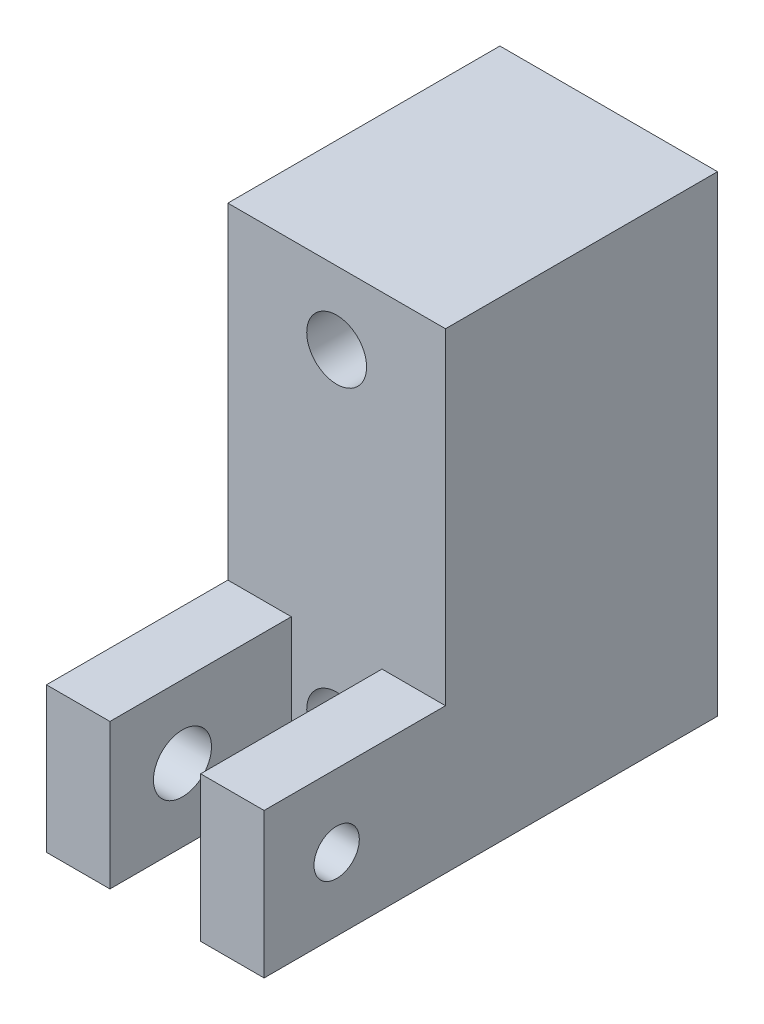
ISO-10303-21;
HEADER;
FILE_DESCRIPTION(('STEP AP214'),'2;1');
FILE_NAME('part.step','',(''),(''),'','','');
FILE_SCHEMA(('AUTOMOTIVE_DESIGN { 1 0 10303 214 1 1 1 1 }'));
ENDSEC;
DATA;
#1=APPLICATION_CONTEXT('core data for automotive mechanical design processes');
#2=APPLICATION_PROTOCOL_DEFINITION('international standard','automotive_design',2000,#1);
#3=PRODUCT_CONTEXT('',#1,'mechanical');
#4=PRODUCT('Part','Part','',(#3));
#5=PRODUCT_RELATED_PRODUCT_CATEGORY('part','',(#4));
#6=PRODUCT_DEFINITION_FORMATION('','',#4);
#7=PRODUCT_DEFINITION_CONTEXT('part definition',#1,'design');
#8=PRODUCT_DEFINITION('design','',#6,#7);
#9=PRODUCT_DEFINITION_SHAPE('','',#8);
#10=(LENGTH_UNIT() NAMED_UNIT(*) SI_UNIT(.MILLI.,.METRE.));
#11=(NAMED_UNIT(*) PLANE_ANGLE_UNIT() SI_UNIT($,.RADIAN.));
#12=(NAMED_UNIT(*) SI_UNIT($,.STERADIAN.) SOLID_ANGLE_UNIT());
#13=UNCERTAINTY_MEASURE_WITH_UNIT(LENGTH_MEASURE(1.E-05),#10,'distance_accuracy_value','');
#14=(GEOMETRIC_REPRESENTATION_CONTEXT(3) GLOBAL_UNCERTAINTY_ASSIGNED_CONTEXT((#13)) GLOBAL_UNIT_ASSIGNED_CONTEXT((#10,
#11,#12)) REPRESENTATION_CONTEXT('',''));
#15=CARTESIAN_POINT('',(0.,0.,0.));
#16=DIRECTION('',(0.,0.,1.));
#17=DIRECTION('',(1.,0.,0.));
#18=AXIS2_PLACEMENT_3D('',#15,#16,#17);
#19=CARTESIAN_POINT('',(6.,0.,0.));
#20=DIRECTION('',(-1.,0.,0.));
#21=DIRECTION('',(0.,0.,1.));
#22=AXIS2_PLACEMENT_3D('',#19,#20,#21);
#23=PLANE('',#22);
#24=DIRECTION('',(0.,1.,0.));
#25=VECTOR('',#24,1.);
#26=CARTESIAN_POINT('',(6.,-13.,-7.5));
#27=LINE('',#26,#25);
#28=CARTESIAN_POINT('',(6.,-13.,-7.5));
#29=VERTEX_POINT('',#28);
#30=CARTESIAN_POINT('',(6.,13.,-7.5));
#31=VERTEX_POINT('',#30);
#32=EDGE_CURVE('E152',#29,#31,#27,.T.);
#33=ORIENTED_EDGE('',*,*,#32,.T.);
#34=DIRECTION('',(0.,0.,1.));
#35=VECTOR('',#34,1.);
#36=CARTESIAN_POINT('',(6.,13.,7.5));
#37=LINE('',#36,#35);
#38=CARTESIAN_POINT('',(6.,13.,7.5));
#39=VERTEX_POINT('',#38);
#40=EDGE_CURVE('E95',#31,#39,#37,.T.);
#41=ORIENTED_EDGE('',*,*,#40,.T.);
#42=DIRECTION('',(0.,-1.,0.));
#43=VECTOR('',#42,1.);
#44=CARTESIAN_POINT('',(6.,-5.,7.5));
#45=LINE('',#44,#43);
#46=CARTESIAN_POINT('',(6.,-5.,7.5));
#47=VERTEX_POINT('',#46);
#48=EDGE_CURVE('E111',#39,#47,#45,.T.);
#49=ORIENTED_EDGE('',*,*,#48,.T.);
#50=DIRECTION('',(0.,0.,1.));
#51=VECTOR('',#50,1.);
#52=CARTESIAN_POINT('',(6.,-5.,7.5));
#53=LINE('',#52,#51);
#54=CARTESIAN_POINT('',(6.,-5.,17.5));
#55=VERTEX_POINT('',#54);
#56=EDGE_CURVE('E104',#47,#55,#53,.T.);
#57=ORIENTED_EDGE('',*,*,#56,.T.);
#58=DIRECTION('',(0.,-1.,0.));
#59=VECTOR('',#58,1.);
#60=CARTESIAN_POINT('',(6.,-13.,17.5));
#61=LINE('',#60,#59);
#62=CARTESIAN_POINT('',(6.,-13.,17.5));
#63=VERTEX_POINT('',#62);
#64=EDGE_CURVE('E108',#55,#63,#61,.T.);
#65=ORIENTED_EDGE('',*,*,#64,.T.);
#66=DIRECTION('',(0.,0.,-1.));
#67=VECTOR('',#66,1.);
#68=CARTESIAN_POINT('',(6.,-13.,7.5));
#69=LINE('',#68,#67);
#70=EDGE_CURVE('E61',#63,#29,#69,.T.);
#71=ORIENTED_EDGE('',*,*,#70,.T.);
#72=EDGE_LOOP('',(#33,#41,#49,#57,#65,#71));
#73=FACE_BOUND('',#72,.T.);
#74=CARTESIAN_POINT('',(6.,-9.,13.5));
#75=DIRECTION('',(1.,0.,0.));
#76=DIRECTION('',(0.,0.,-1.));
#77=AXIS2_PLACEMENT_3D('',#74,#75,#76);
#78=CIRCLE('',#77,1.24999999999999);
#79=CARTESIAN_POINT('',(6.,-9.,12.25));
#80=VERTEX_POINT('',#79);
#81=EDGE_CURVE('E217',#80,#80,#78,.T.);
#82=ORIENTED_EDGE('',*,*,#81,.F.);
#83=EDGE_LOOP('',(#82));
#84=FACE_BOUND('',#83,.T.);
#85=ADVANCED_FACE('F37',(#73,#84),#23,.F.);
#86=CARTESIAN_POINT('',(6.,-5.,7.5));
#87=DIRECTION('',(0.,-1.,0.));
#88=DIRECTION('',(0.,0.,-1.));
#89=AXIS2_PLACEMENT_3D('',#86,#87,#88);
#90=PLANE('',#89);
#91=DIRECTION('',(-1.,0.,0.));
#92=VECTOR('',#91,1.);
#93=CARTESIAN_POINT('',(6.,-5.,7.5));
#94=LINE('',#93,#92);
#95=CARTESIAN_POINT('',(2.5,-5.,7.5));
#96=VERTEX_POINT('',#95);
#97=EDGE_CURVE('E156',#47,#96,#94,.T.);
#98=ORIENTED_EDGE('',*,*,#97,.T.);
#99=DIRECTION('',(0.,0.,-1.));
#100=VECTOR('',#99,1.);
#101=CARTESIAN_POINT('',(2.5,-5.,17.5));
#102=LINE('',#101,#100);
#103=CARTESIAN_POINT('',(2.5,-5.,17.5));
#104=VERTEX_POINT('',#103);
#105=EDGE_CURVE('E122',#104,#96,#102,.T.);
#106=ORIENTED_EDGE('',*,*,#105,.F.);
#107=DIRECTION('',(-1.,0.,0.));
#108=VECTOR('',#107,1.);
#109=CARTESIAN_POINT('',(6.,-5.,17.5));
#110=LINE('',#109,#108);
#111=EDGE_CURVE('E118',#55,#104,#110,.T.);
#112=ORIENTED_EDGE('',*,*,#111,.F.);
#113=ORIENTED_EDGE('',*,*,#56,.F.);
#114=EDGE_LOOP('',(#98,#106,#112,#113));
#115=FACE_BOUND('',#114,.T.);
#116=ADVANCED_FACE('F119',(#115),#90,.F.);
#117=CARTESIAN_POINT('',(6.,-13.,17.5));
#118=DIRECTION('',(0.,0.,-1.));
#119=DIRECTION('',(0.,1.,0.));
#120=AXIS2_PLACEMENT_3D('',#117,#118,#119);
#121=PLANE('',#120);
#122=ORIENTED_EDGE('',*,*,#111,.T.);
#123=DIRECTION('',(0.,1.,0.));
#124=VECTOR('',#123,1.);
#125=CARTESIAN_POINT('',(2.5,-13.001,17.5));
#126=LINE('',#125,#124);
#127=CARTESIAN_POINT('',(2.5,-13.,17.5));
#128=VERTEX_POINT('',#127);
#129=EDGE_CURVE('E196',#128,#104,#126,.T.);
#130=ORIENTED_EDGE('',*,*,#129,.F.);
#131=DIRECTION('',(-1.,0.,0.));
#132=VECTOR('',#131,1.);
#133=CARTESIAN_POINT('',(6.,-13.,17.5));
#134=LINE('',#133,#132);
#135=EDGE_CURVE('E130',#63,#128,#134,.T.);
#136=ORIENTED_EDGE('',*,*,#135,.F.);
#137=ORIENTED_EDGE('',*,*,#64,.F.);
#138=EDGE_LOOP('',(#122,#130,#136,#137));
#139=FACE_BOUND('',#138,.T.);
#140=ADVANCED_FACE('F128',(#139),#121,.F.);
#141=CARTESIAN_POINT('',(6.,-13.,-7.5));
#142=DIRECTION('',(0.,0.,1.));
#143=DIRECTION('',(1.,0.,0.));
#144=AXIS2_PLACEMENT_3D('',#141,#142,#143);
#145=PLANE('',#144);
#146=CARTESIAN_POINT('',(0.,9.,-7.5));
#147=DIRECTION('',(0.,0.,-1.));
#148=DIRECTION('',(-1.,0.,0.));
#149=AXIS2_PLACEMENT_3D('',#146,#147,#148);
#150=CIRCLE('',#149,1.65);
#151=CARTESIAN_POINT('',(-1.65,9.,-7.5));
#152=VERTEX_POINT('',#151);
#153=EDGE_CURVE('E235',#152,#152,#150,.T.);
#154=ORIENTED_EDGE('',*,*,#153,.F.);
#155=EDGE_LOOP('',(#154));
#156=FACE_BOUND('',#155,.T.);
#157=CARTESIAN_POINT('',(0.,-9.,-7.5));
#158=DIRECTION('',(0.,0.,-1.));
#159=DIRECTION('',(-1.,0.,0.));
#160=AXIS2_PLACEMENT_3D('',#157,#158,#159);
#161=CIRCLE('',#160,1.65);
#162=CARTESIAN_POINT('',(-1.65,-9.,-7.5));
#163=VERTEX_POINT('',#162);
#164=EDGE_CURVE('E229',#163,#163,#161,.T.);
#165=ORIENTED_EDGE('',*,*,#164,.F.);
#166=EDGE_LOOP('',(#165));
#167=FACE_BOUND('',#166,.T.);
#168=DIRECTION('',(0.,1.,0.));
#169=VECTOR('',#168,1.);
#170=CARTESIAN_POINT('',(-6.,-13.,-7.5));
#171=LINE('',#170,#169);
#172=CARTESIAN_POINT('',(-6.,-13.,-7.5));
#173=VERTEX_POINT('',#172);
#174=CARTESIAN_POINT('',(-6.,13.,-7.5));
#175=VERTEX_POINT('',#174);
#176=EDGE_CURVE('E136',#173,#175,#171,.T.);
#177=ORIENTED_EDGE('',*,*,#176,.T.);
#178=DIRECTION('',(-1.,0.,0.));
#179=VECTOR('',#178,1.);
#180=CARTESIAN_POINT('',(6.,13.,-7.5));
#181=LINE('',#180,#179);
#182=EDGE_CURVE('E11',#31,#175,#181,.T.);
#183=ORIENTED_EDGE('',*,*,#182,.F.);
#184=ORIENTED_EDGE('',*,*,#32,.F.);
#185=DIRECTION('',(-1.,0.,0.));
#186=VECTOR('',#185,1.);
#187=CARTESIAN_POINT('',(6.,-13.,-7.5));
#188=LINE('',#187,#186);
#189=EDGE_CURVE('E132',#29,#173,#188,.T.);
#190=ORIENTED_EDGE('',*,*,#189,.T.);
#191=EDGE_LOOP('',(#177,#183,#184,#190));
#192=FACE_BOUND('',#191,.T.);
#193=ADVANCED_FACE('F39',(#156,#167,#192),#145,.F.);
#194=CARTESIAN_POINT('',(6.,13.,7.5));
#195=DIRECTION('',(0.,-1.,0.));
#196=DIRECTION('',(0.,0.,-1.));
#197=AXIS2_PLACEMENT_3D('',#194,#195,#196);
#198=PLANE('',#197);
#199=DIRECTION('',(0.,0.,1.));
#200=VECTOR('',#199,1.);
#201=CARTESIAN_POINT('',(-6.,13.,7.5));
#202=LINE('',#201,#200);
#203=CARTESIAN_POINT('',(-6.,13.,7.5));
#204=VERTEX_POINT('',#203);
#205=EDGE_CURVE('E139',#175,#204,#202,.T.);
#206=ORIENTED_EDGE('',*,*,#205,.T.);
#207=DIRECTION('',(-1.,0.,0.));
#208=VECTOR('',#207,1.);
#209=CARTESIAN_POINT('',(6.,13.,7.5));
#210=LINE('',#209,#208);
#211=EDGE_CURVE('E45',#39,#204,#210,.T.);
#212=ORIENTED_EDGE('',*,*,#211,.F.);
#213=ORIENTED_EDGE('',*,*,#40,.F.);
#214=ORIENTED_EDGE('',*,*,#182,.T.);
#215=EDGE_LOOP('',(#206,#212,#213,#214));
#216=FACE_BOUND('',#215,.T.);
#217=ADVANCED_FACE('F243',(#216),#198,.F.);
#218=CARTESIAN_POINT('',(6.,-5.,7.5));
#219=DIRECTION('',(0.,0.,-1.));
#220=DIRECTION('',(-1.,0.,0.));
#221=AXIS2_PLACEMENT_3D('',#218,#219,#220);
#222=PLANE('',#221);
#223=CARTESIAN_POINT('',(0.,9.,7.5));
#224=DIRECTION('',(0.,0.,-1.));
#225=DIRECTION('',(-1.,0.,0.));
#226=AXIS2_PLACEMENT_3D('',#223,#224,#225);
#227=CIRCLE('',#226,1.65);
#228=CARTESIAN_POINT('',(-1.65,9.,7.5));
#229=VERTEX_POINT('',#228);
#230=EDGE_CURVE('E232',#229,#229,#227,.T.);
#231=ORIENTED_EDGE('',*,*,#230,.T.);
#232=EDGE_LOOP('',(#231));
#233=FACE_BOUND('',#232,.T.);
#234=CARTESIAN_POINT('',(0.,-9.,7.5));
#235=DIRECTION('',(0.,0.,-1.));
#236=DIRECTION('',(-1.,0.,0.));
#237=AXIS2_PLACEMENT_3D('',#234,#235,#236);
#238=CIRCLE('',#237,1.65);
#239=CARTESIAN_POINT('',(-1.65,-9.,7.5));
#240=VERTEX_POINT('',#239);
#241=EDGE_CURVE('E226',#240,#240,#238,.T.);
#242=ORIENTED_EDGE('',*,*,#241,.T.);
#243=EDGE_LOOP('',(#242));
#244=FACE_BOUND('',#243,.T.);
#245=DIRECTION('',(0.,-1.,0.));
#246=VECTOR('',#245,1.);
#247=CARTESIAN_POINT('',(-6.,-5.,7.5));
#248=LINE('',#247,#246);
#249=CARTESIAN_POINT('',(-6.,-5.,7.5));
#250=VERTEX_POINT('',#249);
#251=EDGE_CURVE('E142',#204,#250,#248,.T.);
#252=ORIENTED_EDGE('',*,*,#251,.T.);
#253=CARTESIAN_POINT('',(-2.5,-5.,7.5));
#254=VERTEX_POINT('',#253);
#255=EDGE_CURVE('E125',#254,#250,#94,.T.);
#256=ORIENTED_EDGE('',*,*,#255,.F.);
#257=DIRECTION('',(0.,1.,0.));
#258=VECTOR('',#257,1.);
#259=CARTESIAN_POINT('',(-2.5,-13.001,7.49999999999999));
#260=LINE('',#259,#258);
#261=CARTESIAN_POINT('',(-2.5,-13.,7.49999999999999));
#262=VERTEX_POINT('',#261);
#263=EDGE_CURVE('E176',#262,#254,#260,.T.);
#264=ORIENTED_EDGE('',*,*,#263,.F.);
#265=DIRECTION('',(1.,0.,0.));
#266=VECTOR('',#265,1.);
#267=CARTESIAN_POINT('',(-2.5,-13.,7.49999999999999));
#268=LINE('',#267,#266);
#269=CARTESIAN_POINT('',(2.5,-13.,7.49999999999999));
#270=VERTEX_POINT('',#269);
#271=EDGE_CURVE('E140',#262,#270,#268,.T.);
#272=ORIENTED_EDGE('',*,*,#271,.T.);
#273=DIRECTION('',(0.,1.,0.));
#274=VECTOR('',#273,1.);
#275=CARTESIAN_POINT('',(2.5,-13.001,7.49999999999999));
#276=LINE('',#275,#274);
#277=EDGE_CURVE('E197',#270,#96,#276,.T.);
#278=ORIENTED_EDGE('',*,*,#277,.T.);
#279=ORIENTED_EDGE('',*,*,#97,.F.);
#280=ORIENTED_EDGE('',*,*,#48,.F.);
#281=ORIENTED_EDGE('',*,*,#211,.T.);
#282=EDGE_LOOP('',(#252,#256,#264,#272,#278,#279,#280,#281));
#283=FACE_BOUND('',#282,.T.);
#284=ADVANCED_FACE('F160',(#233,#244,#283),#222,.F.);
#285=CARTESIAN_POINT('',(-2.5,-5.,17.5));
#286=VERTEX_POINT('',#285);
#287=CARTESIAN_POINT('',(-6.,-5.,17.5));
#288=VERTEX_POINT('',#287);
#289=EDGE_CURVE('E126',#286,#288,#110,.T.);
#290=ORIENTED_EDGE('',*,*,#289,.F.);
#291=DIRECTION('',(0.,0.,1.));
#292=VECTOR('',#291,1.);
#293=CARTESIAN_POINT('',(-2.5,-5.,17.5));
#294=LINE('',#293,#292);
#295=EDGE_CURVE('E174',#254,#286,#294,.T.);
#296=ORIENTED_EDGE('',*,*,#295,.F.);
#297=ORIENTED_EDGE('',*,*,#255,.T.);
#298=DIRECTION('',(0.,0.,1.));
#299=VECTOR('',#298,1.);
#300=CARTESIAN_POINT('',(-6.,-5.,7.5));
#301=LINE('',#300,#299);
#302=EDGE_CURVE('E145',#250,#288,#301,.T.);
#303=ORIENTED_EDGE('',*,*,#302,.T.);
#304=EDGE_LOOP('',(#290,#296,#297,#303));
#305=FACE_BOUND('',#304,.T.);
#306=ADVANCED_FACE('F169',(#305),#90,.F.);
#307=CARTESIAN_POINT('',(-2.5,-13.,17.5));
#308=VERTEX_POINT('',#307);
#309=CARTESIAN_POINT('',(-6.,-13.,17.5));
#310=VERTEX_POINT('',#309);
#311=EDGE_CURVE('E154',#308,#310,#134,.T.);
#312=ORIENTED_EDGE('',*,*,#311,.F.);
#313=DIRECTION('',(0.,1.,0.));
#314=VECTOR('',#313,1.);
#315=CARTESIAN_POINT('',(-2.5,-13.001,17.5));
#316=LINE('',#315,#314);
#317=EDGE_CURVE('E189',#308,#286,#316,.T.);
#318=ORIENTED_EDGE('',*,*,#317,.T.);
#319=ORIENTED_EDGE('',*,*,#289,.T.);
#320=DIRECTION('',(0.,-1.,0.));
#321=VECTOR('',#320,1.);
#322=CARTESIAN_POINT('',(-6.,-13.,17.5));
#323=LINE('',#322,#321);
#324=EDGE_CURVE('E148',#288,#310,#323,.T.);
#325=ORIENTED_EDGE('',*,*,#324,.T.);
#326=EDGE_LOOP('',(#312,#318,#319,#325));
#327=FACE_BOUND('',#326,.T.);
#328=ADVANCED_FACE('F275',(#327),#121,.F.);
#329=CARTESIAN_POINT('',(6.,-13.,7.5));
#330=DIRECTION('',(0.,1.,0.));
#331=DIRECTION('',(0.,0.,1.));
#332=AXIS2_PLACEMENT_3D('',#329,#330,#331);
#333=PLANE('',#332);
#334=ORIENTED_EDGE('',*,*,#135,.T.);
#335=DIRECTION('',(0.,0.,1.));
#336=VECTOR('',#335,1.);
#337=CARTESIAN_POINT('',(2.5,-13.,17.5));
#338=LINE('',#337,#336);
#339=EDGE_CURVE('E194',#270,#128,#338,.T.);
#340=ORIENTED_EDGE('',*,*,#339,.F.);
#341=ORIENTED_EDGE('',*,*,#271,.F.);
#342=DIRECTION('',(0.,0.,-1.));
#343=VECTOR('',#342,1.);
#344=CARTESIAN_POINT('',(-2.5,-13.,17.5));
#345=LINE('',#344,#343);
#346=EDGE_CURVE('E52',#308,#262,#345,.T.);
#347=ORIENTED_EDGE('',*,*,#346,.F.);
#348=ORIENTED_EDGE('',*,*,#311,.T.);
#349=DIRECTION('',(0.,0.,-1.));
#350=VECTOR('',#349,1.);
#351=CARTESIAN_POINT('',(-6.,-13.,7.5));
#352=LINE('',#351,#350);
#353=EDGE_CURVE('E87',#310,#173,#352,.T.);
#354=ORIENTED_EDGE('',*,*,#353,.T.);
#355=ORIENTED_EDGE('',*,*,#189,.F.);
#356=ORIENTED_EDGE('',*,*,#70,.F.);
#357=EDGE_LOOP('',(#334,#340,#341,#347,#348,#354,#355,#356));
#358=FACE_BOUND('',#357,.T.);
#359=ADVANCED_FACE('F200',(#358),#333,.F.);
#360=CARTESIAN_POINT('',(-6.,0.,0.));
#361=DIRECTION('',(-1.,0.,0.));
#362=DIRECTION('',(0.,0.,1.));
#363=AXIS2_PLACEMENT_3D('',#360,#361,#362);
#364=PLANE('',#363);
#365=CARTESIAN_POINT('',(-6.,-9.,13.5));
#366=DIRECTION('',(-1.,0.,0.));
#367=DIRECTION('',(0.,0.,1.));
#368=AXIS2_PLACEMENT_3D('',#365,#366,#367);
#369=CIRCLE('',#368,1.6);
#370=CARTESIAN_POINT('',(-6.,-9.,15.1));
#371=VERTEX_POINT('',#370);
#372=EDGE_CURVE('E223',#371,#371,#369,.T.);
#373=ORIENTED_EDGE('',*,*,#372,.F.);
#374=EDGE_LOOP('',(#373));
#375=FACE_BOUND('',#374,.T.);
#376=ORIENTED_EDGE('',*,*,#176,.F.);
#377=ORIENTED_EDGE('',*,*,#353,.F.);
#378=ORIENTED_EDGE('',*,*,#324,.F.);
#379=ORIENTED_EDGE('',*,*,#302,.F.);
#380=ORIENTED_EDGE('',*,*,#251,.F.);
#381=ORIENTED_EDGE('',*,*,#205,.F.);
#382=EDGE_LOOP('',(#376,#377,#378,#379,#380,#381));
#383=FACE_BOUND('',#382,.T.);
#384=ADVANCED_FACE('F165',(#375,#383),#364,.T.);
#385=CARTESIAN_POINT('',(2.5,-13.001,17.5));
#386=DIRECTION('',(1.,0.,0.));
#387=DIRECTION('',(0.,0.,-1.));
#388=AXIS2_PLACEMENT_3D('',#385,#386,#387);
#389=PLANE('',#388);
#390=CARTESIAN_POINT('',(2.5,-9.,13.5));
#391=DIRECTION('',(1.,0.,0.));
#392=DIRECTION('',(0.,0.,-1.));
#393=AXIS2_PLACEMENT_3D('',#390,#391,#392);
#394=CIRCLE('',#393,1.24999999999999);
#395=CARTESIAN_POINT('',(2.5,-9.,12.25));
#396=VERTEX_POINT('',#395);
#397=EDGE_CURVE('E214',#396,#396,#394,.T.);
#398=ORIENTED_EDGE('',*,*,#397,.T.);
#399=EDGE_LOOP('',(#398));
#400=FACE_BOUND('',#399,.T.);
#401=ORIENTED_EDGE('',*,*,#339,.T.);
#402=ORIENTED_EDGE('',*,*,#129,.T.);
#403=ORIENTED_EDGE('',*,*,#105,.T.);
#404=ORIENTED_EDGE('',*,*,#277,.F.);
#405=EDGE_LOOP('',(#401,#402,#403,#404));
#406=FACE_BOUND('',#405,.T.);
#407=ADVANCED_FACE('F195',(#400,#406),#389,.F.);
#408=CARTESIAN_POINT('',(-2.5,-13.001,17.5));
#409=DIRECTION('',(-1.,0.,0.));
#410=DIRECTION('',(0.,0.,1.));
#411=AXIS2_PLACEMENT_3D('',#408,#409,#410);
#412=PLANE('',#411);
#413=CARTESIAN_POINT('',(-2.5,-9.,13.5));
#414=DIRECTION('',(-1.,0.,0.));
#415=DIRECTION('',(0.,0.,1.));
#416=AXIS2_PLACEMENT_3D('',#413,#414,#415);
#417=CIRCLE('',#416,1.6);
#418=CARTESIAN_POINT('',(-2.5,-9.,15.1));
#419=VERTEX_POINT('',#418);
#420=EDGE_CURVE('E220',#419,#419,#417,.T.);
#421=ORIENTED_EDGE('',*,*,#420,.T.);
#422=EDGE_LOOP('',(#421));
#423=FACE_BOUND('',#422,.T.);
#424=ORIENTED_EDGE('',*,*,#346,.T.);
#425=ORIENTED_EDGE('',*,*,#263,.T.);
#426=ORIENTED_EDGE('',*,*,#295,.T.);
#427=ORIENTED_EDGE('',*,*,#317,.F.);
#428=EDGE_LOOP('',(#424,#425,#426,#427));
#429=FACE_BOUND('',#428,.T.);
#430=ADVANCED_FACE('F320',(#423,#429),#412,.F.);
#431=CARTESIAN_POINT('',(6.,-9.,13.5));
#432=DIRECTION('',(1.,0.,0.));
#433=DIRECTION('',(0.,0.,-1.));
#434=AXIS2_PLACEMENT_3D('',#431,#432,#433);
#435=CYLINDRICAL_SURFACE('',#434,1.24999999999999);
#436=ORIENTED_EDGE('',*,*,#397,.F.);
#437=EDGE_LOOP('',(#436));
#438=FACE_BOUND('',#437,.T.);
#439=ORIENTED_EDGE('',*,*,#81,.T.);
#440=EDGE_LOOP('',(#439));
#441=FACE_BOUND('',#440,.T.);
#442=ADVANCED_FACE('F257',(#438,#441),#435,.F.);
#443=CARTESIAN_POINT('',(-6.,-9.,13.5));
#444=DIRECTION('',(-1.,0.,0.));
#445=DIRECTION('',(0.,0.,1.));
#446=AXIS2_PLACEMENT_3D('',#443,#444,#445);
#447=CYLINDRICAL_SURFACE('',#446,1.6);
#448=ORIENTED_EDGE('',*,*,#420,.F.);
#449=EDGE_LOOP('',(#448));
#450=FACE_BOUND('',#449,.T.);
#451=ORIENTED_EDGE('',*,*,#372,.T.);
#452=EDGE_LOOP('',(#451));
#453=FACE_BOUND('',#452,.T.);
#454=ADVANCED_FACE('F248',(#450,#453),#447,.F.);
#455=CARTESIAN_POINT('',(0.,-9.,-7.5));
#456=DIRECTION('',(0.,0.,-1.));
#457=DIRECTION('',(-1.,0.,0.));
#458=AXIS2_PLACEMENT_3D('',#455,#456,#457);
#459=CYLINDRICAL_SURFACE('',#458,1.65);
#460=ORIENTED_EDGE('',*,*,#241,.F.);
#461=EDGE_LOOP('',(#460));
#462=FACE_BOUND('',#461,.T.);
#463=ORIENTED_EDGE('',*,*,#164,.T.);
#464=EDGE_LOOP('',(#463));
#465=FACE_BOUND('',#464,.T.);
#466=ADVANCED_FACE('F246',(#462,#465),#459,.F.);
#467=CARTESIAN_POINT('',(0.,9.,-7.5));
#468=DIRECTION('',(0.,0.,-1.));
#469=DIRECTION('',(-1.,0.,0.));
#470=AXIS2_PLACEMENT_3D('',#467,#468,#469);
#471=CYLINDRICAL_SURFACE('',#470,1.65);
#472=ORIENTED_EDGE('',*,*,#230,.F.);
#473=EDGE_LOOP('',(#472));
#474=FACE_BOUND('',#473,.T.);
#475=ORIENTED_EDGE('',*,*,#153,.T.);
#476=EDGE_LOOP('',(#475));
#477=FACE_BOUND('',#476,.T.);
#478=ADVANCED_FACE('F239',(#474,#477),#471,.F.);
#479=CLOSED_SHELL('',(#85,#116,#140,#193,#217,#284,#306,#328,#359,#384,#407,#430,#442,#454,#466,#478));
#480=MANIFOLD_SOLID_BREP('B2',#479);
#481=ADVANCED_BREP_SHAPE_REPRESENTATION('',(#18,#480),#14);
#482=SHAPE_DEFINITION_REPRESENTATION(#9,#481);
ENDSEC;
END-ISO-10303-21;
